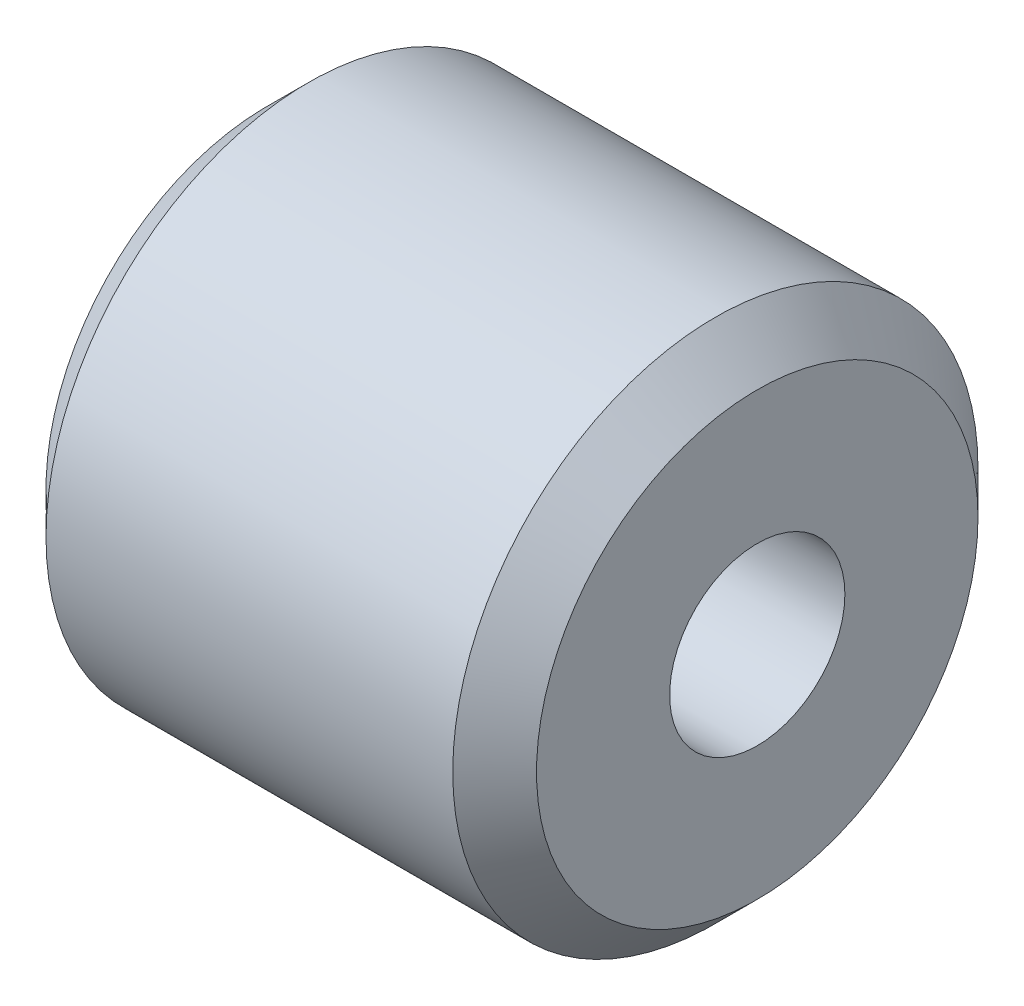
ISO-10303-21;
HEADER;
FILE_DESCRIPTION(('STEP AP214'),'2;1');
FILE_NAME('part.step','',(''),(''),'','','');
FILE_SCHEMA(('AUTOMOTIVE_DESIGN { 1 0 10303 214 1 1 1 1 }'));
ENDSEC;
DATA;
#1=APPLICATION_CONTEXT('core data for automotive mechanical design processes');
#2=APPLICATION_PROTOCOL_DEFINITION('international standard','automotive_design',2000,#1);
#3=PRODUCT_CONTEXT('',#1,'mechanical');
#4=PRODUCT('Part','Part','',(#3));
#5=PRODUCT_RELATED_PRODUCT_CATEGORY('part','',(#4));
#6=PRODUCT_DEFINITION_FORMATION('','',#4);
#7=PRODUCT_DEFINITION_CONTEXT('part definition',#1,'design');
#8=PRODUCT_DEFINITION('design','',#6,#7);
#9=PRODUCT_DEFINITION_SHAPE('','',#8);
#10=(LENGTH_UNIT() NAMED_UNIT(*) SI_UNIT(.MILLI.,.METRE.));
#11=(NAMED_UNIT(*) PLANE_ANGLE_UNIT() SI_UNIT($,.RADIAN.));
#12=(NAMED_UNIT(*) SI_UNIT($,.STERADIAN.) SOLID_ANGLE_UNIT());
#13=UNCERTAINTY_MEASURE_WITH_UNIT(LENGTH_MEASURE(1.E-05),#10,'distance_accuracy_value','');
#14=(GEOMETRIC_REPRESENTATION_CONTEXT(3) GLOBAL_UNCERTAINTY_ASSIGNED_CONTEXT((#13)) GLOBAL_UNIT_ASSIGNED_CONTEXT((#10,
#11,#12)) REPRESENTATION_CONTEXT('',''));
#15=CARTESIAN_POINT('',(0.,0.,0.));
#16=DIRECTION('',(0.,0.,1.));
#17=DIRECTION('',(1.,0.,0.));
#18=AXIS2_PLACEMENT_3D('',#15,#16,#17);
#19=CARTESIAN_POINT('',(8.9,0.,0.));
#20=DIRECTION('',(1.,0.,0.));
#21=DIRECTION('',(0.,0.,-1.));
#22=AXIS2_PLACEMENT_3D('',#19,#20,#21);
#23=PLANE('',#22);
#24=CARTESIAN_POINT('',(8.9,0.,0.));
#25=DIRECTION('',(1.,0.,0.));
#26=DIRECTION('',(0.,0.,-1.));
#27=AXIS2_PLACEMENT_3D('',#24,#25,#26);
#28=CIRCLE('',#27,4.005);
#29=CARTESIAN_POINT('',(8.9,0.,-4.005));
#30=VERTEX_POINT('',#29);
#31=EDGE_CURVE('E10',#30,#30,#28,.T.);
#32=ORIENTED_EDGE('',*,*,#31,.T.);
#33=EDGE_LOOP('',(#32));
#34=FACE_BOUND('',#33,.T.);
#35=CARTESIAN_POINT('',(8.9,0.,0.));
#36=DIRECTION('',(1.,0.,0.));
#37=DIRECTION('',(0.,0.,-1.));
#38=AXIS2_PLACEMENT_3D('',#35,#36,#37);
#39=CIRCLE('',#38,1.59);
#40=CARTESIAN_POINT('',(8.9,0.,-1.59));
#41=VERTEX_POINT('',#40);
#42=EDGE_CURVE('E64',#41,#41,#39,.T.);
#43=ORIENTED_EDGE('',*,*,#42,.F.);
#44=EDGE_LOOP('',(#43));
#45=FACE_BOUND('',#44,.T.);
#46=ADVANCED_FACE('F39',(#34,#45),#23,.T.);
#47=CARTESIAN_POINT('',(0.,0.,0.));
#48=DIRECTION('',(1.,0.,0.));
#49=DIRECTION('',(0.,0.,-1.));
#50=AXIS2_PLACEMENT_3D('',#47,#48,#49);
#51=PLANE('',#50);
#52=CARTESIAN_POINT('',(0.,0.,0.));
#53=DIRECTION('',(1.,0.,0.));
#54=DIRECTION('',(0.,0.,-1.));
#55=AXIS2_PLACEMENT_3D('',#52,#53,#54);
#56=CIRCLE('',#55,4.005);
#57=CARTESIAN_POINT('',(0.,0.,-4.005));
#58=VERTEX_POINT('',#57);
#59=EDGE_CURVE('E48',#58,#58,#56,.F.);
#60=ORIENTED_EDGE('',*,*,#59,.T.);
#61=EDGE_LOOP('',(#60));
#62=FACE_BOUND('',#61,.T.);
#63=CARTESIAN_POINT('',(0.,0.,0.));
#64=DIRECTION('',(1.,0.,0.));
#65=DIRECTION('',(0.,0.,-1.));
#66=AXIS2_PLACEMENT_3D('',#63,#64,#65);
#67=CIRCLE('',#66,1.59);
#68=CARTESIAN_POINT('',(0.,0.,-1.59));
#69=VERTEX_POINT('',#68);
#70=EDGE_CURVE('E65',#69,#69,#67,.T.);
#71=ORIENTED_EDGE('',*,*,#70,.T.);
#72=EDGE_LOOP('',(#71));
#73=FACE_BOUND('',#72,.T.);
#74=ADVANCED_FACE('F77',(#62,#73),#51,.F.);
#75=CARTESIAN_POINT('',(8.9,0.,0.));
#76=DIRECTION('',(-1.,0.,0.));
#77=DIRECTION('',(0.,0.,1.));
#78=AXIS2_PLACEMENT_3D('',#75,#76,#77);
#79=CYLINDRICAL_SURFACE('',#78,4.765);
#80=CARTESIAN_POINT('',(0.76,0.,0.));
#81=DIRECTION('',(1.,0.,0.));
#82=DIRECTION('',(0.,0.,-1.));
#83=AXIS2_PLACEMENT_3D('',#80,#81,#82);
#84=CIRCLE('',#83,4.765);
#85=CARTESIAN_POINT('',(0.76,0.,-4.765));
#86=VERTEX_POINT('',#85);
#87=EDGE_CURVE('E53',#86,#86,#84,.T.);
#88=ORIENTED_EDGE('',*,*,#87,.T.);
#89=EDGE_LOOP('',(#88));
#90=FACE_BOUND('',#89,.T.);
#91=CARTESIAN_POINT('',(8.14,0.,0.));
#92=DIRECTION('',(1.,0.,0.));
#93=DIRECTION('',(0.,0.,-1.));
#94=AXIS2_PLACEMENT_3D('',#91,#92,#93);
#95=CIRCLE('',#94,4.765);
#96=CARTESIAN_POINT('',(8.14,0.,-4.765));
#97=VERTEX_POINT('',#96);
#98=EDGE_CURVE('E58',#97,#97,#95,.F.);
#99=ORIENTED_EDGE('',*,*,#98,.T.);
#100=EDGE_LOOP('',(#99));
#101=FACE_BOUND('',#100,.T.);
#102=ADVANCED_FACE('F82',(#90,#101),#79,.T.);
#103=CARTESIAN_POINT('',(8.9,0.,0.));
#104=DIRECTION('',(-1.,0.,0.));
#105=DIRECTION('',(0.,0.,1.));
#106=AXIS2_PLACEMENT_3D('',#103,#104,#105);
#107=CYLINDRICAL_SURFACE('',#106,1.59);
#108=ORIENTED_EDGE('',*,*,#42,.T.);
#109=EDGE_LOOP('',(#108));
#110=FACE_BOUND('',#109,.T.);
#111=ORIENTED_EDGE('',*,*,#70,.F.);
#112=EDGE_LOOP('',(#111));
#113=FACE_BOUND('',#112,.T.);
#114=ADVANCED_FACE('F73',(#110,#113),#107,.F.);
#115=CARTESIAN_POINT('',(0.76,0.,0.));
#116=DIRECTION('',(1.,0.,0.));
#117=DIRECTION('',(0.,0.,-1.));
#118=AXIS2_PLACEMENT_3D('',#115,#116,#117);
#119=CONICAL_SURFACE('',#118,4.765,0.78539816339745);
#120=ORIENTED_EDGE('',*,*,#59,.F.);
#121=EDGE_LOOP('',(#120));
#122=FACE_BOUND('',#121,.T.);
#123=ORIENTED_EDGE('',*,*,#87,.F.);
#124=EDGE_LOOP('',(#123));
#125=FACE_BOUND('',#124,.T.);
#126=ADVANCED_FACE('F89',(#122,#125),#119,.T.);
#127=CARTESIAN_POINT('',(8.9,0.,0.));
#128=DIRECTION('',(-1.,0.,0.));
#129=DIRECTION('',(0.,0.,1.));
#130=AXIS2_PLACEMENT_3D('',#127,#128,#129);
#131=CONICAL_SURFACE('',#130,4.005,0.785398163397446);
#132=ORIENTED_EDGE('',*,*,#98,.F.);
#133=EDGE_LOOP('',(#132));
#134=FACE_BOUND('',#133,.T.);
#135=ORIENTED_EDGE('',*,*,#31,.F.);
#136=EDGE_LOOP('',(#135));
#137=FACE_BOUND('',#136,.T.);
#138=ADVANCED_FACE('F42',(#134,#137),#131,.T.);
#139=CLOSED_SHELL('',(#46,#74,#102,#114,#126,#138));
#140=MANIFOLD_SOLID_BREP('B2',#139);
#141=ADVANCED_BREP_SHAPE_REPRESENTATION('',(#18,#140),#14);
#142=SHAPE_DEFINITION_REPRESENTATION(#9,#141);
ENDSEC;
END-ISO-10303-21;
